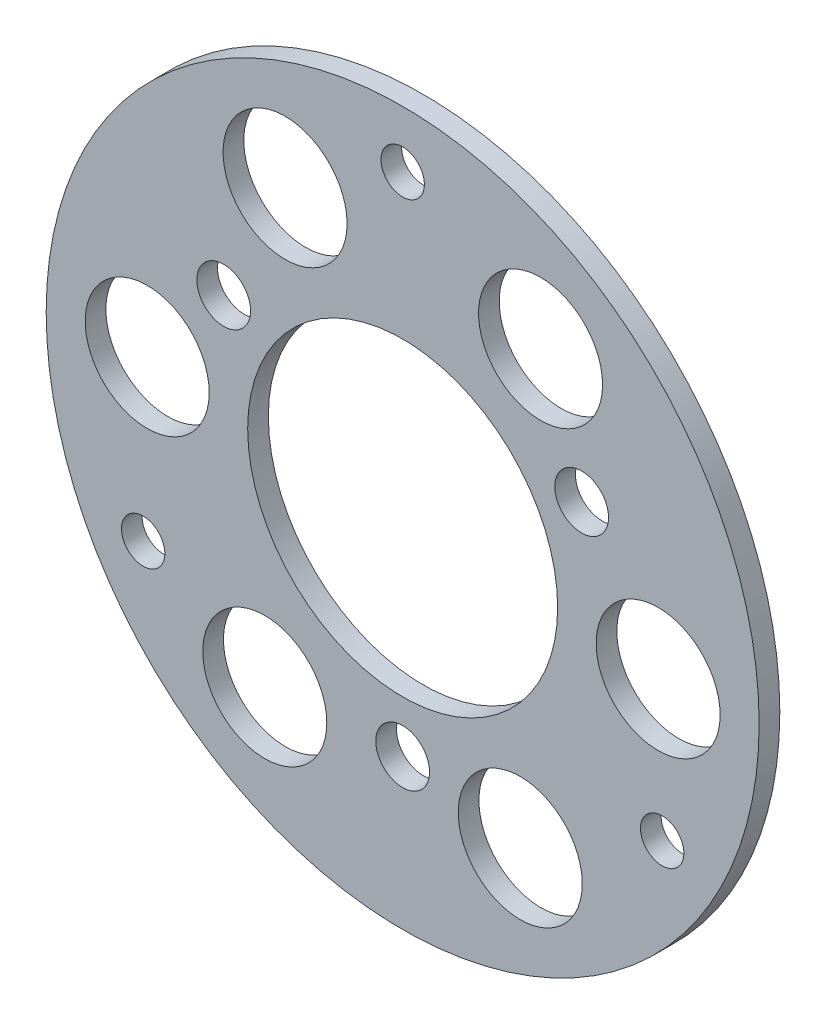
ISO-10303-21;
HEADER;
FILE_DESCRIPTION(('STEP AP214'),'2;1');
FILE_NAME('part.step','',(''),(''),'','','');
FILE_SCHEMA(('AUTOMOTIVE_DESIGN { 1 0 10303 214 1 1 1 1 }'));
ENDSEC;
DATA;
#1=APPLICATION_CONTEXT('core data for automotive mechanical design processes');
#2=APPLICATION_PROTOCOL_DEFINITION('international standard','automotive_design',2000,#1);
#3=PRODUCT_CONTEXT('',#1,'mechanical');
#4=PRODUCT('Part','Part','',(#3));
#5=PRODUCT_RELATED_PRODUCT_CATEGORY('part','',(#4));
#6=PRODUCT_DEFINITION_FORMATION('','',#4);
#7=PRODUCT_DEFINITION_CONTEXT('part definition',#1,'design');
#8=PRODUCT_DEFINITION('design','',#6,#7);
#9=PRODUCT_DEFINITION_SHAPE('','',#8);
#10=(LENGTH_UNIT() NAMED_UNIT(*) SI_UNIT(.MILLI.,.METRE.));
#11=(NAMED_UNIT(*) PLANE_ANGLE_UNIT() SI_UNIT($,.RADIAN.));
#12=(NAMED_UNIT(*) SI_UNIT($,.STERADIAN.) SOLID_ANGLE_UNIT());
#13=UNCERTAINTY_MEASURE_WITH_UNIT(LENGTH_MEASURE(1.E-05),#10,'distance_accuracy_value','');
#14=(GEOMETRIC_REPRESENTATION_CONTEXT(3) GLOBAL_UNCERTAINTY_ASSIGNED_CONTEXT((#13)) GLOBAL_UNIT_ASSIGNED_CONTEXT((#10,
#11,#12)) REPRESENTATION_CONTEXT('',''));
#15=CARTESIAN_POINT('',(0.,0.,0.));
#16=DIRECTION('',(0.,0.,1.));
#17=DIRECTION('',(1.,0.,0.));
#18=AXIS2_PLACEMENT_3D('',#15,#16,#17);
#19=CARTESIAN_POINT('',(0.,0.,2.));
#20=DIRECTION('',(0.,0.,1.));
#21=DIRECTION('',(1.,0.,0.));
#22=AXIS2_PLACEMENT_3D('',#19,#20,#21);
#23=PLANE('',#22);
#24=CARTESIAN_POINT('',(11.3794731006509,-21.9788555651008,2.));
#25=DIRECTION('',(0.,0.,1.));
#26=DIRECTION('',(1.,0.,0.));
#27=AXIS2_PLACEMENT_3D('',#24,#25,#26);
#28=CIRCLE('',#27,6.);
#29=CARTESIAN_POINT('',(17.3794731006509,-21.9788555651008,2.));
#30=VERTEX_POINT('',#29);
#31=EDGE_CURVE('E10',#30,#30,#28,.T.);
#32=ORIENTED_EDGE('',*,*,#31,.F.);
#33=EDGE_LOOP('',(#32));
#34=FACE_BOUND('',#33,.T.);
#35=CARTESIAN_POINT('',(-13.3445107151608,-20.8443405693958,2.));
#36=DIRECTION('',(0.,0.,1.));
#37=DIRECTION('',(1.,0.,0.));
#38=AXIS2_PLACEMENT_3D('',#35,#36,#37);
#39=CIRCLE('',#38,6.);
#40=CARTESIAN_POINT('',(-7.34451071516082,-20.8443405693958,2.));
#41=VERTEX_POINT('',#40);
#42=EDGE_CURVE('E21',#41,#41,#39,.T.);
#43=ORIENTED_EDGE('',*,*,#42,.F.);
#44=EDGE_LOOP('',(#43));
#45=FACE_BOUND('',#44,.T.);
#46=CARTESIAN_POINT('',(-24.7239838158117,1.13451499570503,2.));
#47=DIRECTION('',(0.,0.,1.));
#48=DIRECTION('',(1.,0.,0.));
#49=AXIS2_PLACEMENT_3D('',#46,#47,#48);
#50=CIRCLE('',#49,6.);
#51=CARTESIAN_POINT('',(-18.7239838158117,1.13451499570503,2.));
#52=VERTEX_POINT('',#51);
#53=EDGE_CURVE('E25',#52,#52,#50,.T.);
#54=ORIENTED_EDGE('',*,*,#53,.F.);
#55=EDGE_LOOP('',(#54));
#56=FACE_BOUND('',#55,.T.);
#57=CARTESIAN_POINT('',(-11.3794731006509,21.9788555651008,2.));
#58=DIRECTION('',(0.,0.,1.));
#59=DIRECTION('',(1.,0.,0.));
#60=AXIS2_PLACEMENT_3D('',#57,#58,#59);
#61=CIRCLE('',#60,6.);
#62=CARTESIAN_POINT('',(-5.37947310065093,21.9788555651008,2.));
#63=VERTEX_POINT('',#62);
#64=EDGE_CURVE('E29',#63,#63,#61,.T.);
#65=ORIENTED_EDGE('',*,*,#64,.F.);
#66=EDGE_LOOP('',(#65));
#67=FACE_BOUND('',#66,.T.);
#68=CARTESIAN_POINT('',(13.3445107151608,20.8443405693958,2.));
#69=DIRECTION('',(0.,0.,1.));
#70=DIRECTION('',(1.,0.,0.));
#71=AXIS2_PLACEMENT_3D('',#68,#69,#70);
#72=CIRCLE('',#71,5.99999999999999);
#73=CARTESIAN_POINT('',(19.3445107151608,20.8443405693958,2.));
#74=VERTEX_POINT('',#73);
#75=EDGE_CURVE('E34',#74,#74,#72,.T.);
#76=ORIENTED_EDGE('',*,*,#75,.F.);
#77=EDGE_LOOP('',(#76));
#78=FACE_BOUND('',#77,.T.);
#79=CARTESIAN_POINT('',(24.7239838158117,-1.13451499570503,2.));
#80=DIRECTION('',(0.,0.,1.));
#81=DIRECTION('',(1.,0.,0.));
#82=AXIS2_PLACEMENT_3D('',#79,#80,#81);
#83=CIRCLE('',#82,6.);
#84=CARTESIAN_POINT('',(30.7239838158117,-1.13451499570503,2.));
#85=VERTEX_POINT('',#84);
#86=EDGE_CURVE('E37',#85,#85,#83,.T.);
#87=ORIENTED_EDGE('',*,*,#86,.F.);
#88=EDGE_LOOP('',(#87));
#89=FACE_BOUND('',#88,.T.);
#90=CARTESIAN_POINT('',(17.3205080756896,10.0000000000025,2.));
#91=DIRECTION('',(0.,0.,1.));
#92=DIRECTION('',(1.,0.,0.));
#93=AXIS2_PLACEMENT_3D('',#90,#91,#92);
#94=CIRCLE('',#93,2.6000000000027);
#95=CARTESIAN_POINT('',(19.9205080756923,10.0000000000025,2.));
#96=VERTEX_POINT('',#95);
#97=EDGE_CURVE('E40',#96,#96,#94,.T.);
#98=ORIENTED_EDGE('',*,*,#97,.F.);
#99=EDGE_LOOP('',(#98));
#100=FACE_BOUND('',#99,.T.);
#101=CARTESIAN_POINT('',(-25.1147367097513,-14.4999999999955,2.));
#102=DIRECTION('',(0.,0.,1.));
#103=DIRECTION('',(1.,0.,0.));
#104=AXIS2_PLACEMENT_3D('',#101,#102,#103);
#105=CIRCLE('',#104,2.1);
#106=CARTESIAN_POINT('',(-23.0147367097513,-14.4999999999955,2.));
#107=VERTEX_POINT('',#106);
#108=EDGE_CURVE('E43',#107,#107,#105,.T.);
#109=ORIENTED_EDGE('',*,*,#108,.F.);
#110=EDGE_LOOP('',(#109));
#111=FACE_BOUND('',#110,.T.);
#112=CARTESIAN_POINT('',(0.,0.,2.));
#113=DIRECTION('',(0.,0.,1.));
#114=DIRECTION('',(1.,0.,0.));
#115=AXIS2_PLACEMENT_3D('',#112,#113,#114);
#116=CIRCLE('',#115,15.);
#117=CARTESIAN_POINT('',(15.,0.,2.));
#118=VERTEX_POINT('',#117);
#119=EDGE_CURVE('E46',#118,#118,#116,.T.);
#120=ORIENTED_EDGE('',*,*,#119,.F.);
#121=EDGE_LOOP('',(#120));
#122=FACE_BOUND('',#121,.T.);
#123=CARTESIAN_POINT('',(0.,0.,2.));
#124=DIRECTION('',(0.,0.,1.));
#125=DIRECTION('',(1.,0.,0.));
#126=AXIS2_PLACEMENT_3D('',#123,#124,#125);
#127=CIRCLE('',#126,34.5);
#128=CARTESIAN_POINT('',(34.5,0.,2.));
#129=VERTEX_POINT('',#128);
#130=EDGE_CURVE('E49',#129,#129,#127,.T.);
#131=ORIENTED_EDGE('',*,*,#130,.T.);
#132=EDGE_LOOP('',(#131));
#133=FACE_BOUND('',#132,.T.);
#134=CARTESIAN_POINT('',(0.,29.,2.));
#135=DIRECTION('',(0.,0.,1.));
#136=DIRECTION('',(1.,0.,0.));
#137=AXIS2_PLACEMENT_3D('',#134,#135,#136);
#138=CIRCLE('',#137,2.1);
#139=CARTESIAN_POINT('',(2.1,29.,2.));
#140=VERTEX_POINT('',#139);
#141=EDGE_CURVE('E52',#140,#140,#138,.T.);
#142=ORIENTED_EDGE('',*,*,#141,.F.);
#143=EDGE_LOOP('',(#142));
#144=FACE_BOUND('',#143,.T.);
#145=CARTESIAN_POINT('',(25.1147367097474,-14.5000000000023,2.));
#146=DIRECTION('',(0.,0.,1.));
#147=DIRECTION('',(1.,0.,0.));
#148=AXIS2_PLACEMENT_3D('',#145,#146,#147);
#149=CIRCLE('',#148,2.1);
#150=CARTESIAN_POINT('',(27.2147367097474,-14.5000000000023,2.));
#151=VERTEX_POINT('',#150);
#152=EDGE_CURVE('E55',#151,#151,#149,.T.);
#153=ORIENTED_EDGE('',*,*,#152,.F.);
#154=EDGE_LOOP('',(#153));
#155=FACE_BOUND('',#154,.T.);
#156=CARTESIAN_POINT('',(-17.3205080756888,9.99999999999996,2.));
#157=DIRECTION('',(0.,0.,1.));
#158=DIRECTION('',(1.,0.,0.));
#159=AXIS2_PLACEMENT_3D('',#156,#157,#158);
#160=CIRCLE('',#159,2.6);
#161=CARTESIAN_POINT('',(-14.7205080756888,9.99999999999996,2.));
#162=VERTEX_POINT('',#161);
#163=EDGE_CURVE('E58',#162,#162,#160,.T.);
#164=ORIENTED_EDGE('',*,*,#163,.F.);
#165=EDGE_LOOP('',(#164));
#166=FACE_BOUND('',#165,.T.);
#167=CARTESIAN_POINT('',(0.,-19.999999999998,2.));
#168=DIRECTION('',(0.,0.,1.));
#169=DIRECTION('',(1.,0.,0.));
#170=AXIS2_PLACEMENT_3D('',#167,#168,#169);
#171=CIRCLE('',#170,2.59999999999871);
#172=CARTESIAN_POINT('',(2.59999999999869,-19.999999999998,2.));
#173=VERTEX_POINT('',#172);
#174=EDGE_CURVE('E61',#173,#173,#171,.T.);
#175=ORIENTED_EDGE('',*,*,#174,.F.);
#176=EDGE_LOOP('',(#175));
#177=FACE_BOUND('',#176,.T.);
#178=ADVANCED_FACE('F15',(#34,#45,#56,#67,#78,#89,#100,#111,#122,#133,#144,#155,#166,#177),#23,.T.);
#179=CARTESIAN_POINT('',(0.,0.,0.));
#180=DIRECTION('',(0.,0.,1.));
#181=DIRECTION('',(1.,0.,0.));
#182=AXIS2_PLACEMENT_3D('',#179,#180,#181);
#183=PLANE('',#182);
#184=CARTESIAN_POINT('',(11.3794731006509,-21.9788555651008,0.));
#185=DIRECTION('',(0.,0.,1.));
#186=DIRECTION('',(1.,0.,0.));
#187=AXIS2_PLACEMENT_3D('',#184,#185,#186);
#188=CIRCLE('',#187,6.);
#189=CARTESIAN_POINT('',(17.3794731006509,-21.9788555651008,0.));
#190=VERTEX_POINT('',#189);
#191=EDGE_CURVE('E64',#190,#190,#188,.T.);
#192=ORIENTED_EDGE('',*,*,#191,.T.);
#193=EDGE_LOOP('',(#192));
#194=FACE_BOUND('',#193,.T.);
#195=CARTESIAN_POINT('',(-13.3445107151608,-20.8443405693958,0.));
#196=DIRECTION('',(0.,0.,1.));
#197=DIRECTION('',(1.,0.,0.));
#198=AXIS2_PLACEMENT_3D('',#195,#196,#197);
#199=CIRCLE('',#198,6.);
#200=CARTESIAN_POINT('',(-7.34451071516082,-20.8443405693958,0.));
#201=VERTEX_POINT('',#200);
#202=EDGE_CURVE('E67',#201,#201,#199,.T.);
#203=ORIENTED_EDGE('',*,*,#202,.T.);
#204=EDGE_LOOP('',(#203));
#205=FACE_BOUND('',#204,.T.);
#206=CARTESIAN_POINT('',(-24.7239838158117,1.13451499570503,0.));
#207=DIRECTION('',(0.,0.,1.));
#208=DIRECTION('',(1.,0.,0.));
#209=AXIS2_PLACEMENT_3D('',#206,#207,#208);
#210=CIRCLE('',#209,6.);
#211=CARTESIAN_POINT('',(-18.7239838158117,1.13451499570503,0.));
#212=VERTEX_POINT('',#211);
#213=EDGE_CURVE('E70',#212,#212,#210,.T.);
#214=ORIENTED_EDGE('',*,*,#213,.T.);
#215=EDGE_LOOP('',(#214));
#216=FACE_BOUND('',#215,.T.);
#217=CARTESIAN_POINT('',(-11.3794731006509,21.9788555651008,0.));
#218=DIRECTION('',(0.,0.,1.));
#219=DIRECTION('',(1.,0.,0.));
#220=AXIS2_PLACEMENT_3D('',#217,#218,#219);
#221=CIRCLE('',#220,6.);
#222=CARTESIAN_POINT('',(-5.37947310065093,21.9788555651008,0.));
#223=VERTEX_POINT('',#222);
#224=EDGE_CURVE('E73',#223,#223,#221,.T.);
#225=ORIENTED_EDGE('',*,*,#224,.T.);
#226=EDGE_LOOP('',(#225));
#227=FACE_BOUND('',#226,.T.);
#228=CARTESIAN_POINT('',(13.3445107151608,20.8443405693958,0.));
#229=DIRECTION('',(0.,0.,1.));
#230=DIRECTION('',(1.,0.,0.));
#231=AXIS2_PLACEMENT_3D('',#228,#229,#230);
#232=CIRCLE('',#231,5.99999999999999);
#233=CARTESIAN_POINT('',(19.3445107151608,20.8443405693958,0.));
#234=VERTEX_POINT('',#233);
#235=EDGE_CURVE('E76',#234,#234,#232,.T.);
#236=ORIENTED_EDGE('',*,*,#235,.T.);
#237=EDGE_LOOP('',(#236));
#238=FACE_BOUND('',#237,.T.);
#239=CARTESIAN_POINT('',(24.7239838158117,-1.13451499570503,0.));
#240=DIRECTION('',(0.,0.,1.));
#241=DIRECTION('',(1.,0.,0.));
#242=AXIS2_PLACEMENT_3D('',#239,#240,#241);
#243=CIRCLE('',#242,6.);
#244=CARTESIAN_POINT('',(30.7239838158117,-1.13451499570503,0.));
#245=VERTEX_POINT('',#244);
#246=EDGE_CURVE('E79',#245,#245,#243,.T.);
#247=ORIENTED_EDGE('',*,*,#246,.T.);
#248=EDGE_LOOP('',(#247));
#249=FACE_BOUND('',#248,.T.);
#250=CARTESIAN_POINT('',(0.,0.,0.));
#251=DIRECTION('',(0.,0.,1.));
#252=DIRECTION('',(1.,0.,0.));
#253=AXIS2_PLACEMENT_3D('',#250,#251,#252);
#254=CIRCLE('',#253,34.5);
#255=CARTESIAN_POINT('',(34.5,0.,0.));
#256=VERTEX_POINT('',#255);
#257=EDGE_CURVE('E82',#256,#256,#254,.T.);
#258=ORIENTED_EDGE('',*,*,#257,.F.);
#259=EDGE_LOOP('',(#258));
#260=FACE_BOUND('',#259,.T.);
#261=CARTESIAN_POINT('',(0.,29.,0.));
#262=DIRECTION('',(0.,0.,1.));
#263=DIRECTION('',(1.,0.,0.));
#264=AXIS2_PLACEMENT_3D('',#261,#262,#263);
#265=CIRCLE('',#264,2.1);
#266=CARTESIAN_POINT('',(2.1,29.,0.));
#267=VERTEX_POINT('',#266);
#268=EDGE_CURVE('E85',#267,#267,#265,.T.);
#269=ORIENTED_EDGE('',*,*,#268,.T.);
#270=EDGE_LOOP('',(#269));
#271=FACE_BOUND('',#270,.T.);
#272=CARTESIAN_POINT('',(0.,0.,0.));
#273=DIRECTION('',(0.,0.,1.));
#274=DIRECTION('',(1.,0.,0.));
#275=AXIS2_PLACEMENT_3D('',#272,#273,#274);
#276=CIRCLE('',#275,15.);
#277=CARTESIAN_POINT('',(15.,0.,0.));
#278=VERTEX_POINT('',#277);
#279=EDGE_CURVE('E88',#278,#278,#276,.T.);
#280=ORIENTED_EDGE('',*,*,#279,.T.);
#281=EDGE_LOOP('',(#280));
#282=FACE_BOUND('',#281,.T.);
#283=CARTESIAN_POINT('',(25.1147367097474,-14.5000000000023,0.));
#284=DIRECTION('',(0.,0.,1.));
#285=DIRECTION('',(1.,0.,0.));
#286=AXIS2_PLACEMENT_3D('',#283,#284,#285);
#287=CIRCLE('',#286,2.1);
#288=CARTESIAN_POINT('',(27.2147367097474,-14.5000000000023,0.));
#289=VERTEX_POINT('',#288);
#290=EDGE_CURVE('E91',#289,#289,#287,.T.);
#291=ORIENTED_EDGE('',*,*,#290,.T.);
#292=EDGE_LOOP('',(#291));
#293=FACE_BOUND('',#292,.T.);
#294=CARTESIAN_POINT('',(-25.1147367097513,-14.4999999999955,0.));
#295=DIRECTION('',(0.,0.,1.));
#296=DIRECTION('',(1.,0.,0.));
#297=AXIS2_PLACEMENT_3D('',#294,#295,#296);
#298=CIRCLE('',#297,2.1);
#299=CARTESIAN_POINT('',(-23.0147367097513,-14.4999999999955,0.));
#300=VERTEX_POINT('',#299);
#301=EDGE_CURVE('E94',#300,#300,#298,.T.);
#302=ORIENTED_EDGE('',*,*,#301,.T.);
#303=EDGE_LOOP('',(#302));
#304=FACE_BOUND('',#303,.T.);
#305=CARTESIAN_POINT('',(-17.3205080756888,9.99999999999996,0.));
#306=DIRECTION('',(0.,0.,1.));
#307=DIRECTION('',(1.,0.,0.));
#308=AXIS2_PLACEMENT_3D('',#305,#306,#307);
#309=CIRCLE('',#308,2.6);
#310=CARTESIAN_POINT('',(-14.7205080756888,9.99999999999996,0.));
#311=VERTEX_POINT('',#310);
#312=EDGE_CURVE('E97',#311,#311,#309,.T.);
#313=ORIENTED_EDGE('',*,*,#312,.T.);
#314=EDGE_LOOP('',(#313));
#315=FACE_BOUND('',#314,.T.);
#316=CARTESIAN_POINT('',(17.3205080756896,10.0000000000025,0.));
#317=DIRECTION('',(0.,0.,1.));
#318=DIRECTION('',(1.,0.,0.));
#319=AXIS2_PLACEMENT_3D('',#316,#317,#318);
#320=CIRCLE('',#319,2.6000000000027);
#321=CARTESIAN_POINT('',(19.9205080756923,10.0000000000025,0.));
#322=VERTEX_POINT('',#321);
#323=EDGE_CURVE('E100',#322,#322,#320,.T.);
#324=ORIENTED_EDGE('',*,*,#323,.T.);
#325=EDGE_LOOP('',(#324));
#326=FACE_BOUND('',#325,.T.);
#327=CARTESIAN_POINT('',(0.,-19.999999999998,0.));
#328=DIRECTION('',(0.,0.,1.));
#329=DIRECTION('',(1.,0.,0.));
#330=AXIS2_PLACEMENT_3D('',#327,#328,#329);
#331=CIRCLE('',#330,2.59999999999871);
#332=CARTESIAN_POINT('',(2.59999999999869,-19.999999999998,0.));
#333=VERTEX_POINT('',#332);
#334=EDGE_CURVE('E103',#333,#333,#331,.T.);
#335=ORIENTED_EDGE('',*,*,#334,.T.);
#336=EDGE_LOOP('',(#335));
#337=FACE_BOUND('',#336,.T.);
#338=ADVANCED_FACE('F107',(#194,#205,#216,#227,#238,#249,#260,#271,#282,#293,#304,#315,#326,
#337),#183,.F.);
#339=CARTESIAN_POINT('',(0.,0.,2.));
#340=DIRECTION('',(0.,0.,-1.));
#341=DIRECTION('',(-1.,0.,0.));
#342=AXIS2_PLACEMENT_3D('',#339,#340,#341);
#343=CYLINDRICAL_SURFACE('',#342,34.5);
#344=ORIENTED_EDGE('',*,*,#130,.F.);
#345=EDGE_LOOP('',(#344));
#346=FACE_BOUND('',#345,.T.);
#347=ORIENTED_EDGE('',*,*,#257,.T.);
#348=EDGE_LOOP('',(#347));
#349=FACE_BOUND('',#348,.T.);
#350=ADVANCED_FACE('F131',(#346,#349),#343,.T.);
#351=CARTESIAN_POINT('',(0.,29.,2.));
#352=DIRECTION('',(0.,0.,-1.));
#353=DIRECTION('',(-1.,0.,0.));
#354=AXIS2_PLACEMENT_3D('',#351,#352,#353);
#355=CYLINDRICAL_SURFACE('',#354,2.1);
#356=ORIENTED_EDGE('',*,*,#141,.T.);
#357=EDGE_LOOP('',(#356));
#358=FACE_BOUND('',#357,.T.);
#359=ORIENTED_EDGE('',*,*,#268,.F.);
#360=EDGE_LOOP('',(#359));
#361=FACE_BOUND('',#360,.T.);
#362=ADVANCED_FACE('F181',(#358,#361),#355,.F.);
#363=CARTESIAN_POINT('',(0.,0.,2.));
#364=DIRECTION('',(0.,0.,-1.));
#365=DIRECTION('',(-1.,0.,0.));
#366=AXIS2_PLACEMENT_3D('',#363,#364,#365);
#367=CYLINDRICAL_SURFACE('',#366,15.);
#368=ORIENTED_EDGE('',*,*,#119,.T.);
#369=EDGE_LOOP('',(#368));
#370=FACE_BOUND('',#369,.T.);
#371=ORIENTED_EDGE('',*,*,#279,.F.);
#372=EDGE_LOOP('',(#371));
#373=FACE_BOUND('',#372,.T.);
#374=ADVANCED_FACE('F177',(#370,#373),#367,.F.);
#375=CARTESIAN_POINT('',(25.1147367097474,-14.5000000000023,2.));
#376=DIRECTION('',(0.,0.,-1.));
#377=DIRECTION('',(-1.,0.,0.));
#378=AXIS2_PLACEMENT_3D('',#375,#376,#377);
#379=CYLINDRICAL_SURFACE('',#378,2.1);
#380=ORIENTED_EDGE('',*,*,#152,.T.);
#381=EDGE_LOOP('',(#380));
#382=FACE_BOUND('',#381,.T.);
#383=ORIENTED_EDGE('',*,*,#290,.F.);
#384=EDGE_LOOP('',(#383));
#385=FACE_BOUND('',#384,.T.);
#386=ADVANCED_FACE('F171',(#382,#385),#379,.F.);
#387=CARTESIAN_POINT('',(-25.1147367097513,-14.4999999999955,2.));
#388=DIRECTION('',(0.,0.,-1.));
#389=DIRECTION('',(-1.,0.,0.));
#390=AXIS2_PLACEMENT_3D('',#387,#388,#389);
#391=CYLINDRICAL_SURFACE('',#390,2.1);
#392=ORIENTED_EDGE('',*,*,#108,.T.);
#393=EDGE_LOOP('',(#392));
#394=FACE_BOUND('',#393,.T.);
#395=ORIENTED_EDGE('',*,*,#301,.F.);
#396=EDGE_LOOP('',(#395));
#397=FACE_BOUND('',#396,.T.);
#398=ADVANCED_FACE('F161',(#394,#397),#391,.F.);
#399=CARTESIAN_POINT('',(-17.3205080756888,9.99999999999996,2.));
#400=DIRECTION('',(0.,0.,-1.));
#401=DIRECTION('',(-1.,0.,0.));
#402=AXIS2_PLACEMENT_3D('',#399,#400,#401);
#403=CYLINDRICAL_SURFACE('',#402,2.6);
#404=ORIENTED_EDGE('',*,*,#163,.T.);
#405=EDGE_LOOP('',(#404));
#406=FACE_BOUND('',#405,.T.);
#407=ORIENTED_EDGE('',*,*,#312,.F.);
#408=EDGE_LOOP('',(#407));
#409=FACE_BOUND('',#408,.T.);
#410=ADVANCED_FACE('F123',(#406,#409),#403,.F.);
#411=CARTESIAN_POINT('',(17.3205080756896,10.0000000000025,2.));
#412=DIRECTION('',(0.,0.,-1.));
#413=DIRECTION('',(-1.,0.,0.));
#414=AXIS2_PLACEMENT_3D('',#411,#412,#413);
#415=CYLINDRICAL_SURFACE('',#414,2.6000000000027);
#416=ORIENTED_EDGE('',*,*,#97,.T.);
#417=EDGE_LOOP('',(#416));
#418=FACE_BOUND('',#417,.T.);
#419=ORIENTED_EDGE('',*,*,#323,.F.);
#420=EDGE_LOOP('',(#419));
#421=FACE_BOUND('',#420,.T.);
#422=ADVANCED_FACE('F112',(#418,#421),#415,.F.);
#423=CARTESIAN_POINT('',(0.,-19.999999999998,2.));
#424=DIRECTION('',(0.,0.,-1.));
#425=DIRECTION('',(-1.,0.,0.));
#426=AXIS2_PLACEMENT_3D('',#423,#424,#425);
#427=CYLINDRICAL_SURFACE('',#426,2.59999999999871);
#428=ORIENTED_EDGE('',*,*,#174,.T.);
#429=EDGE_LOOP('',(#428));
#430=FACE_BOUND('',#429,.T.);
#431=ORIENTED_EDGE('',*,*,#334,.F.);
#432=EDGE_LOOP('',(#431));
#433=FACE_BOUND('',#432,.T.);
#434=ADVANCED_FACE('F109',(#430,#433),#427,.F.);
#435=CARTESIAN_POINT('',(24.7239838158117,-1.13451499570503,-8.));
#436=DIRECTION('',(0.,0.,1.));
#437=DIRECTION('',(1.,0.,0.));
#438=AXIS2_PLACEMENT_3D('',#435,#436,#437);
#439=CYLINDRICAL_SURFACE('',#438,6.);
#440=ORIENTED_EDGE('',*,*,#86,.T.);
#441=EDGE_LOOP('',(#440));
#442=FACE_BOUND('',#441,.T.);
#443=ORIENTED_EDGE('',*,*,#246,.F.);
#444=EDGE_LOOP('',(#443));
#445=FACE_BOUND('',#444,.T.);
#446=ADVANCED_FACE('F111',(#442,#445),#439,.F.);
#447=CARTESIAN_POINT('',(13.3445107151608,20.8443405693958,-8.));
#448=DIRECTION('',(0.,0.,1.));
#449=DIRECTION('',(1.,0.,0.));
#450=AXIS2_PLACEMENT_3D('',#447,#448,#449);
#451=CYLINDRICAL_SURFACE('',#450,5.99999999999999);
#452=ORIENTED_EDGE('',*,*,#75,.T.);
#453=EDGE_LOOP('',(#452));
#454=FACE_BOUND('',#453,.T.);
#455=ORIENTED_EDGE('',*,*,#235,.F.);
#456=EDGE_LOOP('',(#455));
#457=FACE_BOUND('',#456,.T.);
#458=ADVANCED_FACE('F120',(#454,#457),#451,.F.);
#459=CARTESIAN_POINT('',(-11.3794731006509,21.9788555651008,-8.));
#460=DIRECTION('',(0.,0.,1.));
#461=DIRECTION('',(1.,0.,0.));
#462=AXIS2_PLACEMENT_3D('',#459,#460,#461);
#463=CYLINDRICAL_SURFACE('',#462,6.);
#464=ORIENTED_EDGE('',*,*,#64,.T.);
#465=EDGE_LOOP('',(#464));
#466=FACE_BOUND('',#465,.T.);
#467=ORIENTED_EDGE('',*,*,#224,.F.);
#468=EDGE_LOOP('',(#467));
#469=FACE_BOUND('',#468,.T.);
#470=ADVANCED_FACE('F263',(#466,#469),#463,.F.);
#471=CARTESIAN_POINT('',(-24.7239838158117,1.13451499570503,-8.));
#472=DIRECTION('',(0.,0.,1.));
#473=DIRECTION('',(1.,0.,0.));
#474=AXIS2_PLACEMENT_3D('',#471,#472,#473);
#475=CYLINDRICAL_SURFACE('',#474,6.);
#476=ORIENTED_EDGE('',*,*,#53,.T.);
#477=EDGE_LOOP('',(#476));
#478=FACE_BOUND('',#477,.T.);
#479=ORIENTED_EDGE('',*,*,#213,.F.);
#480=EDGE_LOOP('',(#479));
#481=FACE_BOUND('',#480,.T.);
#482=ADVANCED_FACE('F273',(#478,#481),#475,.F.);
#483=CARTESIAN_POINT('',(-13.3445107151608,-20.8443405693958,-8.));
#484=DIRECTION('',(0.,0.,1.));
#485=DIRECTION('',(1.,0.,0.));
#486=AXIS2_PLACEMENT_3D('',#483,#484,#485);
#487=CYLINDRICAL_SURFACE('',#486,6.);
#488=ORIENTED_EDGE('',*,*,#42,.T.);
#489=EDGE_LOOP('',(#488));
#490=FACE_BOUND('',#489,.T.);
#491=ORIENTED_EDGE('',*,*,#202,.F.);
#492=EDGE_LOOP('',(#491));
#493=FACE_BOUND('',#492,.T.);
#494=ADVANCED_FACE('F283',(#490,#493),#487,.F.);
#495=CARTESIAN_POINT('',(11.3794731006509,-21.9788555651008,-8.));
#496=DIRECTION('',(0.,0.,1.));
#497=DIRECTION('',(1.,0.,0.));
#498=AXIS2_PLACEMENT_3D('',#495,#496,#497);
#499=CYLINDRICAL_SURFACE('',#498,6.);
#500=ORIENTED_EDGE('',*,*,#31,.T.);
#501=EDGE_LOOP('',(#500));
#502=FACE_BOUND('',#501,.T.);
#503=ORIENTED_EDGE('',*,*,#191,.F.);
#504=EDGE_LOOP('',(#503));
#505=FACE_BOUND('',#504,.T.);
#506=ADVANCED_FACE('F293',(#502,#505),#499,.F.);
#507=CLOSED_SHELL('',(#178,#338,#350,#362,#374,#386,#398,#410,#422,#434,#446,#458,#470,#482,
#494,#506));
#508=MANIFOLD_SOLID_BREP('B1',#507);
#509=ADVANCED_BREP_SHAPE_REPRESENTATION('',(#18,#508),#14);
#510=SHAPE_DEFINITION_REPRESENTATION(#9,#509);
ENDSEC;
END-ISO-10303-21;
